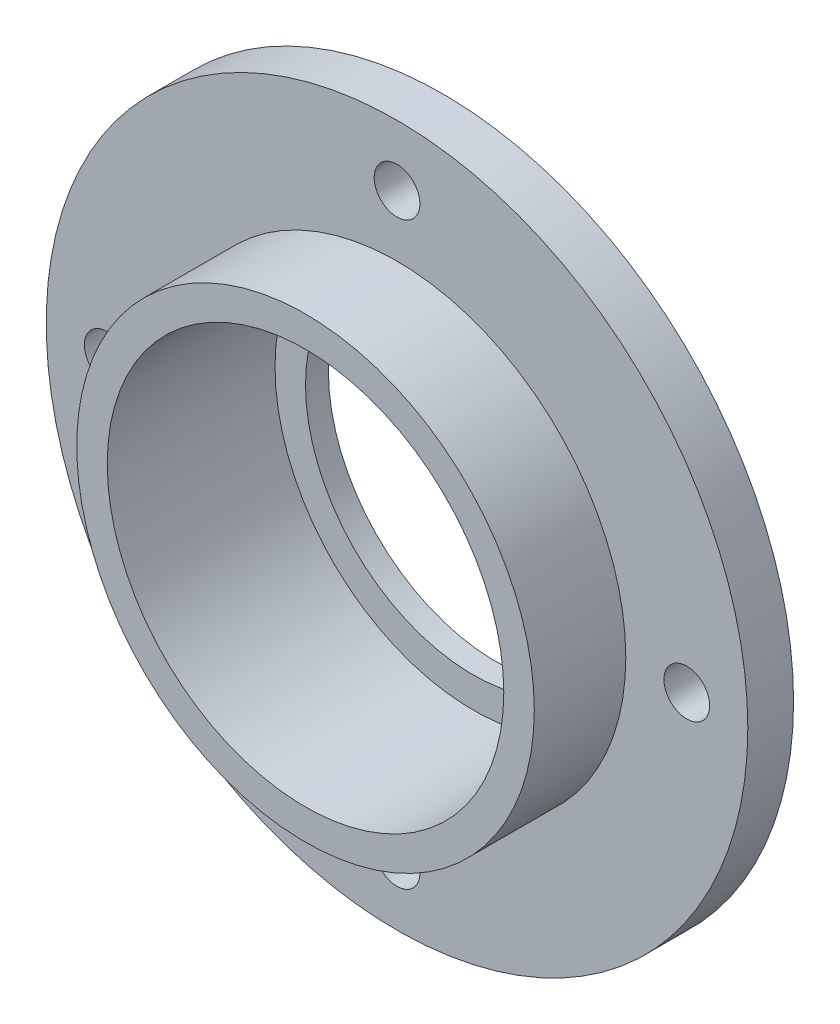
ISO-10303-21;
HEADER;
FILE_DESCRIPTION(('STEP AP214'),'2;1');
FILE_NAME('part.step','',(''),(''),'','','');
FILE_SCHEMA(('AUTOMOTIVE_DESIGN { 1 0 10303 214 1 1 1 1 }'));
ENDSEC;
DATA;
#1=APPLICATION_CONTEXT('core data for automotive mechanical design processes');
#2=APPLICATION_PROTOCOL_DEFINITION('international standard','automotive_design',2000,#1);
#3=PRODUCT_CONTEXT('',#1,'mechanical');
#4=PRODUCT('Part','Part','',(#3));
#5=PRODUCT_RELATED_PRODUCT_CATEGORY('part','',(#4));
#6=PRODUCT_DEFINITION_FORMATION('','',#4);
#7=PRODUCT_DEFINITION_CONTEXT('part definition',#1,'design');
#8=PRODUCT_DEFINITION('design','',#6,#7);
#9=PRODUCT_DEFINITION_SHAPE('','',#8);
#10=(LENGTH_UNIT() NAMED_UNIT(*) SI_UNIT(.MILLI.,.METRE.));
#11=(NAMED_UNIT(*) PLANE_ANGLE_UNIT() SI_UNIT($,.RADIAN.));
#12=(NAMED_UNIT(*) SI_UNIT($,.STERADIAN.) SOLID_ANGLE_UNIT());
#13=UNCERTAINTY_MEASURE_WITH_UNIT(LENGTH_MEASURE(1.E-05),#10,'distance_accuracy_value','');
#14=(GEOMETRIC_REPRESENTATION_CONTEXT(3) GLOBAL_UNCERTAINTY_ASSIGNED_CONTEXT((#13)) GLOBAL_UNIT_ASSIGNED_CONTEXT((#10,
#11,#12)) REPRESENTATION_CONTEXT('',''));
#15=CARTESIAN_POINT('',(0.,0.,0.));
#16=DIRECTION('',(0.,0.,1.));
#17=DIRECTION('',(1.,0.,0.));
#18=AXIS2_PLACEMENT_3D('',#15,#16,#17);
#19=CARTESIAN_POINT('',(0.,0.,-5.));
#20=DIRECTION('',(0.,0.,1.));
#21=DIRECTION('',(1.,0.,0.));
#22=AXIS2_PLACEMENT_3D('',#19,#20,#21);
#23=CYLINDRICAL_SURFACE('',#22,13.);
#24=CARTESIAN_POINT('',(0.,0.,7.5));
#25=DIRECTION('',(0.,0.,1.));
#26=DIRECTION('',(1.,0.,0.));
#27=AXIS2_PLACEMENT_3D('',#24,#25,#26);
#28=CIRCLE('',#27,13.);
#29=CARTESIAN_POINT('',(13.,0.,7.5));
#30=VERTEX_POINT('',#29);
#31=EDGE_CURVE('E67',#30,#30,#28,.T.);
#32=ORIENTED_EDGE('',*,*,#31,.T.);
#33=EDGE_LOOP('',(#32));
#34=FACE_BOUND('',#33,.T.);
#35=CARTESIAN_POINT('',(0.,0.,-3.5));
#36=DIRECTION('',(0.,0.,-1.));
#37=DIRECTION('',(-1.,0.,0.));
#38=AXIS2_PLACEMENT_3D('',#35,#36,#37);
#39=CIRCLE('',#38,13.);
#40=CARTESIAN_POINT('',(-13.,0.,-3.5));
#41=VERTEX_POINT('',#40);
#42=EDGE_CURVE('E10',#41,#41,#39,.F.);
#43=ORIENTED_EDGE('',*,*,#42,.F.);
#44=EDGE_LOOP('',(#43));
#45=FACE_BOUND('',#44,.T.);
#46=ADVANCED_FACE('F41',(#34,#45),#23,.F.);
#47=CARTESIAN_POINT('',(0.,0.,-5.));
#48=DIRECTION('',(0.,0.,1.));
#49=DIRECTION('',(1.,0.,0.));
#50=AXIS2_PLACEMENT_3D('',#47,#48,#49);
#51=CYLINDRICAL_SURFACE('',#50,15.);
#52=CARTESIAN_POINT('',(0.,0.,-5.));
#53=DIRECTION('',(0.,0.,1.));
#54=DIRECTION('',(1.,0.,0.));
#55=AXIS2_PLACEMENT_3D('',#52,#53,#54);
#56=CIRCLE('',#55,15.);
#57=CARTESIAN_POINT('',(15.,0.,-5.));
#58=VERTEX_POINT('',#57);
#59=EDGE_CURVE('E55',#58,#58,#56,.T.);
#60=ORIENTED_EDGE('',*,*,#59,.T.);
#61=EDGE_LOOP('',(#60));
#62=FACE_BOUND('',#61,.T.);
#63=CARTESIAN_POINT('',(0.,0.,-1.5));
#64=DIRECTION('',(0.,0.,1.));
#65=DIRECTION('',(1.,0.,0.));
#66=AXIS2_PLACEMENT_3D('',#63,#64,#65);
#67=CIRCLE('',#66,15.);
#68=CARTESIAN_POINT('',(15.,0.,-1.5));
#69=VERTEX_POINT('',#68);
#70=EDGE_CURVE('E75',#69,#69,#67,.T.);
#71=ORIENTED_EDGE('',*,*,#70,.F.);
#72=EDGE_LOOP('',(#71));
#73=FACE_BOUND('',#72,.T.);
#74=ADVANCED_FACE('F158',(#62,#73),#51,.T.);
#75=CARTESIAN_POINT('',(0.,0.,1.5));
#76=DIRECTION('',(0.,0.,1.));
#77=DIRECTION('',(1.,0.,0.));
#78=AXIS2_PLACEMENT_3D('',#75,#76,#77);
#79=CIRCLE('',#78,15.);
#80=CARTESIAN_POINT('',(15.,0.,1.5));
#81=VERTEX_POINT('',#80);
#82=EDGE_CURVE('E49',#81,#81,#79,.F.);
#83=ORIENTED_EDGE('',*,*,#82,.F.);
#84=EDGE_LOOP('',(#83));
#85=FACE_BOUND('',#84,.T.);
#86=CARTESIAN_POINT('',(0.,0.,7.5));
#87=DIRECTION('',(0.,0.,1.));
#88=DIRECTION('',(1.,0.,0.));
#89=AXIS2_PLACEMENT_3D('',#86,#87,#88);
#90=CIRCLE('',#89,15.);
#91=CARTESIAN_POINT('',(15.,0.,7.5));
#92=VERTEX_POINT('',#91);
#93=EDGE_CURVE('E61',#92,#92,#90,.T.);
#94=ORIENTED_EDGE('',*,*,#93,.F.);
#95=EDGE_LOOP('',(#94));
#96=FACE_BOUND('',#95,.T.);
#97=ADVANCED_FACE('F43',(#85,#96),#51,.T.);
#98=CARTESIAN_POINT('',(0.,0.,-5.));
#99=DIRECTION('',(0.,0.,1.));
#100=DIRECTION('',(1.,0.,0.));
#101=AXIS2_PLACEMENT_3D('',#98,#99,#100);
#102=PLANE('',#101);
#103=ORIENTED_EDGE('',*,*,#59,.F.);
#104=EDGE_LOOP('',(#103));
#105=FACE_BOUND('',#104,.T.);
#106=CARTESIAN_POINT('',(0.,0.,-5.));
#107=DIRECTION('',(0.,0.,-1.));
#108=DIRECTION('',(-1.,0.,0.));
#109=AXIS2_PLACEMENT_3D('',#106,#107,#108);
#110=CIRCLE('',#109,11.);
#111=CARTESIAN_POINT('',(-11.,0.,-5.));
#112=VERTEX_POINT('',#111);
#113=EDGE_CURVE('E84',#112,#112,#110,.T.);
#114=ORIENTED_EDGE('',*,*,#113,.F.);
#115=EDGE_LOOP('',(#114));
#116=FACE_BOUND('',#115,.T.);
#117=ADVANCED_FACE('F155',(#105,#116),#102,.F.);
#118=CARTESIAN_POINT('',(0.,0.,7.5));
#119=DIRECTION('',(0.,0.,1.));
#120=DIRECTION('',(1.,0.,0.));
#121=AXIS2_PLACEMENT_3D('',#118,#119,#120);
#122=PLANE('',#121);
#123=ORIENTED_EDGE('',*,*,#93,.T.);
#124=EDGE_LOOP('',(#123));
#125=FACE_BOUND('',#124,.T.);
#126=ORIENTED_EDGE('',*,*,#31,.F.);
#127=EDGE_LOOP('',(#126));
#128=FACE_BOUND('',#127,.T.);
#129=ADVANCED_FACE('F144',(#125,#128),#122,.T.);
#130=CARTESIAN_POINT('',(0.,0.,-1.5));
#131=DIRECTION('',(0.,0.,1.));
#132=DIRECTION('',(1.,0.,0.));
#133=AXIS2_PLACEMENT_3D('',#130,#131,#132);
#134=CYLINDRICAL_SURFACE('',#133,23.);
#135=CARTESIAN_POINT('',(0.,0.,-1.5));
#136=DIRECTION('',(0.,0.,1.));
#137=DIRECTION('',(1.,0.,0.));
#138=AXIS2_PLACEMENT_3D('',#135,#136,#137);
#139=CIRCLE('',#138,23.);
#140=CARTESIAN_POINT('',(23.,0.,-1.5));
#141=VERTEX_POINT('',#140);
#142=EDGE_CURVE('E71',#141,#141,#139,.T.);
#143=ORIENTED_EDGE('',*,*,#142,.T.);
#144=EDGE_LOOP('',(#143));
#145=FACE_BOUND('',#144,.T.);
#146=CARTESIAN_POINT('',(0.,0.,1.5));
#147=DIRECTION('',(0.,0.,1.));
#148=DIRECTION('',(1.,0.,0.));
#149=AXIS2_PLACEMENT_3D('',#146,#147,#148);
#150=CIRCLE('',#149,23.);
#151=CARTESIAN_POINT('',(23.,0.,1.5));
#152=VERTEX_POINT('',#151);
#153=EDGE_CURVE('E79',#152,#152,#150,.T.);
#154=ORIENTED_EDGE('',*,*,#153,.F.);
#155=EDGE_LOOP('',(#154));
#156=FACE_BOUND('',#155,.T.);
#157=ADVANCED_FACE('F142',(#145,#156),#134,.T.);
#158=CARTESIAN_POINT('',(0.,0.,-1.5));
#159=DIRECTION('',(0.,0.,1.));
#160=DIRECTION('',(1.,0.,0.));
#161=AXIS2_PLACEMENT_3D('',#158,#159,#160);
#162=PLANE('',#161);
#163=CARTESIAN_POINT('',(0.,19.,-1.5));
#164=DIRECTION('',(0.,0.,1.));
#165=DIRECTION('',(1.,0.,0.));
#166=AXIS2_PLACEMENT_3D('',#163,#164,#165);
#167=CIRCLE('',#166,1.5);
#168=CARTESIAN_POINT('',(1.5,19.,-1.5));
#169=VERTEX_POINT('',#168);
#170=EDGE_CURVE('E88',#169,#169,#167,.T.);
#171=ORIENTED_EDGE('',*,*,#170,.T.);
#172=EDGE_LOOP('',(#171));
#173=FACE_BOUND('',#172,.T.);
#174=CARTESIAN_POINT('',(19.,0.,-1.5));
#175=DIRECTION('',(0.,0.,1.));
#176=DIRECTION('',(1.,0.,0.));
#177=AXIS2_PLACEMENT_3D('',#174,#175,#176);
#178=CIRCLE('',#177,1.5);
#179=CARTESIAN_POINT('',(20.5,0.,-1.5));
#180=VERTEX_POINT('',#179);
#181=EDGE_CURVE('E95',#180,#180,#178,.T.);
#182=ORIENTED_EDGE('',*,*,#181,.T.);
#183=EDGE_LOOP('',(#182));
#184=FACE_BOUND('',#183,.T.);
#185=CARTESIAN_POINT('',(0.,-19.0000000000001,-1.5));
#186=DIRECTION('',(0.,0.,1.));
#187=DIRECTION('',(1.,0.,0.));
#188=AXIS2_PLACEMENT_3D('',#185,#186,#187);
#189=CIRCLE('',#188,1.5);
#190=CARTESIAN_POINT('',(1.49999999999994,-19.0000000000001,-1.5));
#191=VERTEX_POINT('',#190);
#192=EDGE_CURVE('E99',#191,#191,#189,.T.);
#193=ORIENTED_EDGE('',*,*,#192,.T.);
#194=EDGE_LOOP('',(#193));
#195=FACE_BOUND('',#194,.T.);
#196=CARTESIAN_POINT('',(-19.0000000000001,0.,-1.5));
#197=DIRECTION('',(0.,0.,1.));
#198=DIRECTION('',(1.,0.,0.));
#199=AXIS2_PLACEMENT_3D('',#196,#197,#198);
#200=CIRCLE('',#199,1.5);
#201=CARTESIAN_POINT('',(-17.5000000000001,0.,-1.5));
#202=VERTEX_POINT('',#201);
#203=EDGE_CURVE('E103',#202,#202,#200,.T.);
#204=ORIENTED_EDGE('',*,*,#203,.T.);
#205=EDGE_LOOP('',(#204));
#206=FACE_BOUND('',#205,.T.);
#207=ORIENTED_EDGE('',*,*,#70,.T.);
#208=EDGE_LOOP('',(#207));
#209=FACE_BOUND('',#208,.T.);
#210=ORIENTED_EDGE('',*,*,#142,.F.);
#211=EDGE_LOOP('',(#210));
#212=FACE_BOUND('',#211,.T.);
#213=ADVANCED_FACE('F132',(#173,#184,#195,#206,#209,#212),#162,.F.);
#214=CARTESIAN_POINT('',(0.,0.,1.5));
#215=DIRECTION('',(0.,0.,1.));
#216=DIRECTION('',(1.,0.,0.));
#217=AXIS2_PLACEMENT_3D('',#214,#215,#216);
#218=PLANE('',#217);
#219=CARTESIAN_POINT('',(0.,19.,1.5));
#220=DIRECTION('',(0.,0.,1.));
#221=DIRECTION('',(1.,0.,0.));
#222=AXIS2_PLACEMENT_3D('',#219,#220,#221);
#223=CIRCLE('',#222,1.5);
#224=CARTESIAN_POINT('',(1.5,19.,1.5));
#225=VERTEX_POINT('',#224);
#226=EDGE_CURVE('E107',#225,#225,#223,.T.);
#227=ORIENTED_EDGE('',*,*,#226,.F.);
#228=EDGE_LOOP('',(#227));
#229=FACE_BOUND('',#228,.T.);
#230=CARTESIAN_POINT('',(19.,0.,1.5));
#231=DIRECTION('',(0.,0.,1.));
#232=DIRECTION('',(1.,0.,0.));
#233=AXIS2_PLACEMENT_3D('',#230,#231,#232);
#234=CIRCLE('',#233,1.5);
#235=CARTESIAN_POINT('',(20.5,0.,1.5));
#236=VERTEX_POINT('',#235);
#237=EDGE_CURVE('E116',#236,#236,#234,.T.);
#238=ORIENTED_EDGE('',*,*,#237,.F.);
#239=EDGE_LOOP('',(#238));
#240=FACE_BOUND('',#239,.T.);
#241=CARTESIAN_POINT('',(0.,-19.0000000000001,1.5));
#242=DIRECTION('',(0.,0.,1.));
#243=DIRECTION('',(1.,0.,0.));
#244=AXIS2_PLACEMENT_3D('',#241,#242,#243);
#245=CIRCLE('',#244,1.5);
#246=CARTESIAN_POINT('',(1.49999999999994,-19.0000000000001,1.5));
#247=VERTEX_POINT('',#246);
#248=EDGE_CURVE('E112',#247,#247,#245,.T.);
#249=ORIENTED_EDGE('',*,*,#248,.F.);
#250=EDGE_LOOP('',(#249));
#251=FACE_BOUND('',#250,.T.);
#252=CARTESIAN_POINT('',(-19.0000000000001,0.,1.5));
#253=DIRECTION('',(0.,0.,1.));
#254=DIRECTION('',(1.,0.,0.));
#255=AXIS2_PLACEMENT_3D('',#252,#253,#254);
#256=CIRCLE('',#255,1.5);
#257=CARTESIAN_POINT('',(-17.5000000000001,0.,1.5));
#258=VERTEX_POINT('',#257);
#259=EDGE_CURVE('E108',#258,#258,#256,.T.);
#260=ORIENTED_EDGE('',*,*,#259,.F.);
#261=EDGE_LOOP('',(#260));
#262=FACE_BOUND('',#261,.T.);
#263=ORIENTED_EDGE('',*,*,#153,.T.);
#264=EDGE_LOOP('',(#263));
#265=FACE_BOUND('',#264,.T.);
#266=ORIENTED_EDGE('',*,*,#82,.T.);
#267=EDGE_LOOP('',(#266));
#268=FACE_BOUND('',#267,.T.);
#269=ADVANCED_FACE('F128',(#229,#240,#251,#262,#265,#268),#218,.T.);
#270=CARTESIAN_POINT('',(0.,0.,-3.5));
#271=DIRECTION('',(0.,0.,-1.));
#272=DIRECTION('',(-1.,0.,0.));
#273=AXIS2_PLACEMENT_3D('',#270,#271,#272);
#274=PLANE('',#273);
#275=CARTESIAN_POINT('',(0.,0.,-3.5));
#276=DIRECTION('',(0.,0.,-1.));
#277=DIRECTION('',(-1.,0.,0.));
#278=AXIS2_PLACEMENT_3D('',#275,#276,#277);
#279=CIRCLE('',#278,11.);
#280=CARTESIAN_POINT('',(-11.,0.,-3.5));
#281=VERTEX_POINT('',#280);
#282=EDGE_CURVE('E83',#281,#281,#279,.T.);
#283=ORIENTED_EDGE('',*,*,#282,.T.);
#284=EDGE_LOOP('',(#283));
#285=FACE_BOUND('',#284,.T.);
#286=ORIENTED_EDGE('',*,*,#42,.T.);
#287=EDGE_LOOP('',(#286));
#288=FACE_BOUND('',#287,.T.);
#289=ADVANCED_FACE('F131',(#285,#288),#274,.F.);
#290=CARTESIAN_POINT('',(0.,0.,-3.5));
#291=DIRECTION('',(0.,0.,-1.));
#292=DIRECTION('',(-1.,0.,0.));
#293=AXIS2_PLACEMENT_3D('',#290,#291,#292);
#294=CYLINDRICAL_SURFACE('',#293,11.);
#295=ORIENTED_EDGE('',*,*,#282,.F.);
#296=EDGE_LOOP('',(#295));
#297=FACE_BOUND('',#296,.T.);
#298=ORIENTED_EDGE('',*,*,#113,.T.);
#299=EDGE_LOOP('',(#298));
#300=FACE_BOUND('',#299,.T.);
#301=ADVANCED_FACE('F176',(#297,#300),#294,.F.);
#302=CARTESIAN_POINT('',(-19.0000000000001,0.,-8.5));
#303=DIRECTION('',(0.,0.,1.));
#304=DIRECTION('',(1.,0.,0.));
#305=AXIS2_PLACEMENT_3D('',#302,#303,#304);
#306=CYLINDRICAL_SURFACE('',#305,1.5);
#307=ORIENTED_EDGE('',*,*,#259,.T.);
#308=EDGE_LOOP('',(#307));
#309=FACE_BOUND('',#308,.T.);
#310=ORIENTED_EDGE('',*,*,#203,.F.);
#311=EDGE_LOOP('',(#310));
#312=FACE_BOUND('',#311,.T.);
#313=ADVANCED_FACE('F178',(#309,#312),#306,.F.);
#314=CARTESIAN_POINT('',(0.,-19.0000000000001,-8.5));
#315=DIRECTION('',(0.,0.,1.));
#316=DIRECTION('',(1.,0.,0.));
#317=AXIS2_PLACEMENT_3D('',#314,#315,#316);
#318=CYLINDRICAL_SURFACE('',#317,1.5);
#319=ORIENTED_EDGE('',*,*,#248,.T.);
#320=EDGE_LOOP('',(#319));
#321=FACE_BOUND('',#320,.T.);
#322=ORIENTED_EDGE('',*,*,#192,.F.);
#323=EDGE_LOOP('',(#322));
#324=FACE_BOUND('',#323,.T.);
#325=ADVANCED_FACE('F184',(#321,#324),#318,.F.);
#326=CARTESIAN_POINT('',(19.,0.,-8.5));
#327=DIRECTION('',(0.,0.,1.));
#328=DIRECTION('',(1.,0.,0.));
#329=AXIS2_PLACEMENT_3D('',#326,#327,#328);
#330=CYLINDRICAL_SURFACE('',#329,1.5);
#331=ORIENTED_EDGE('',*,*,#237,.T.);
#332=EDGE_LOOP('',(#331));
#333=FACE_BOUND('',#332,.T.);
#334=ORIENTED_EDGE('',*,*,#181,.F.);
#335=EDGE_LOOP('',(#334));
#336=FACE_BOUND('',#335,.T.);
#337=ADVANCED_FACE('F193',(#333,#336),#330,.F.);
#338=CARTESIAN_POINT('',(0.,19.,-8.5));
#339=DIRECTION('',(0.,0.,1.));
#340=DIRECTION('',(1.,0.,0.));
#341=AXIS2_PLACEMENT_3D('',#338,#339,#340);
#342=CYLINDRICAL_SURFACE('',#341,1.5);
#343=ORIENTED_EDGE('',*,*,#226,.T.);
#344=EDGE_LOOP('',(#343));
#345=FACE_BOUND('',#344,.T.);
#346=ORIENTED_EDGE('',*,*,#170,.F.);
#347=EDGE_LOOP('',(#346));
#348=FACE_BOUND('',#347,.T.);
#349=ADVANCED_FACE('F125',(#345,#348),#342,.F.);
#350=CLOSED_SHELL('',(#46,#74,#97,#117,#129,#157,#213,#269,#289,#301,#313,#325,#337,#349));
#351=MANIFOLD_SOLID_BREP('B2',#350);
#352=ADVANCED_BREP_SHAPE_REPRESENTATION('',(#18,#351),#14);
#353=SHAPE_DEFINITION_REPRESENTATION(#9,#352);
ENDSEC;
END-ISO-10303-21;
